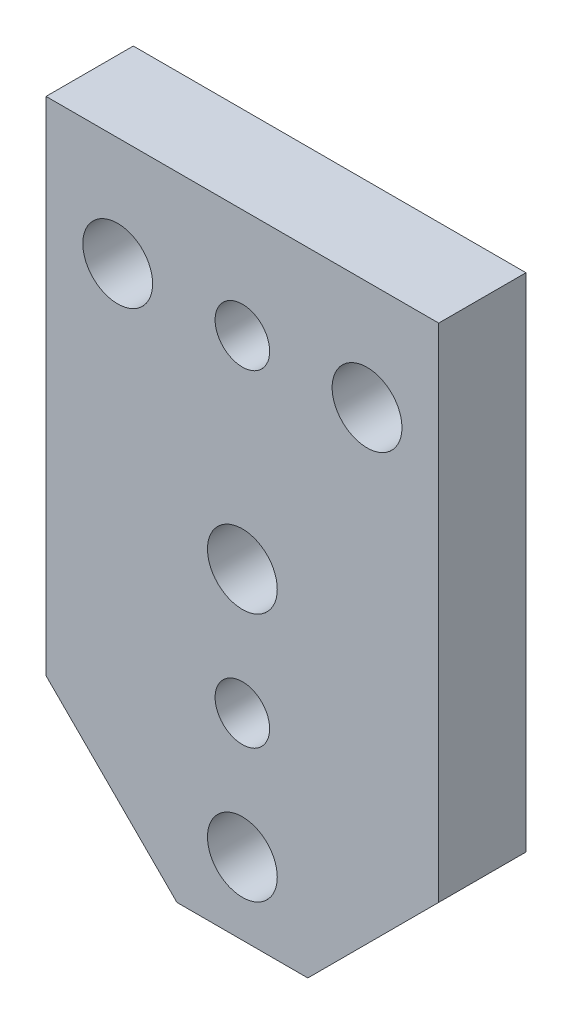
ISO-10303-21;
HEADER;
FILE_DESCRIPTION(('STEP AP214'),'2;1');
FILE_NAME('part.step','',(''),(''),'','','');
FILE_SCHEMA(('AUTOMOTIVE_DESIGN { 1 0 10303 214 1 1 1 1 }'));
ENDSEC;
DATA;
#1=APPLICATION_CONTEXT('core data for automotive mechanical design processes');
#2=APPLICATION_PROTOCOL_DEFINITION('international standard','automotive_design',2000,#1);
#3=PRODUCT_CONTEXT('',#1,'mechanical');
#4=PRODUCT('Part','Part','',(#3));
#5=PRODUCT_RELATED_PRODUCT_CATEGORY('part','',(#4));
#6=PRODUCT_DEFINITION_FORMATION('','',#4);
#7=PRODUCT_DEFINITION_CONTEXT('part definition',#1,'design');
#8=PRODUCT_DEFINITION('design','',#6,#7);
#9=PRODUCT_DEFINITION_SHAPE('','',#8);
#10=(LENGTH_UNIT() NAMED_UNIT(*) SI_UNIT(.MILLI.,.METRE.));
#11=(NAMED_UNIT(*) PLANE_ANGLE_UNIT() SI_UNIT($,.RADIAN.));
#12=(NAMED_UNIT(*) SI_UNIT($,.STERADIAN.) SOLID_ANGLE_UNIT());
#13=UNCERTAINTY_MEASURE_WITH_UNIT(LENGTH_MEASURE(1.E-05),#10,'distance_accuracy_value','');
#14=(GEOMETRIC_REPRESENTATION_CONTEXT(3) GLOBAL_UNCERTAINTY_ASSIGNED_CONTEXT((#13)) GLOBAL_UNIT_ASSIGNED_CONTEXT((#10,
#11,#12)) REPRESENTATION_CONTEXT('',''));
#15=CARTESIAN_POINT('',(0.,0.,0.));
#16=DIRECTION('',(0.,0.,1.));
#17=DIRECTION('',(1.,0.,0.));
#18=AXIS2_PLACEMENT_3D('',#15,#16,#17);
#19=CARTESIAN_POINT('',(9.,-5.,2.));
#20=DIRECTION('',(-1.,0.,0.));
#21=DIRECTION('',(0.,0.,1.));
#22=AXIS2_PLACEMENT_3D('',#19,#20,#21);
#23=PLANE('',#22);
#24=DIRECTION('',(0.,1.,0.));
#25=VECTOR('',#24,1.);
#26=CARTESIAN_POINT('',(9.,-5.,2.));
#27=LINE('',#26,#25);
#28=CARTESIAN_POINT('',(9.,-18.,2.));
#29=VERTEX_POINT('',#28);
#30=CARTESIAN_POINT('',(9.,5.,2.));
#31=VERTEX_POINT('',#30);
#32=EDGE_CURVE('E88',#29,#31,#27,.T.);
#33=ORIENTED_EDGE('',*,*,#32,.F.);
#34=DIRECTION('',(0.,0.,-1.));
#35=VECTOR('',#34,1.);
#36=CARTESIAN_POINT('',(9.,-18.,2.));
#37=LINE('',#36,#35);
#38=CARTESIAN_POINT('',(9.,-18.,-2.));
#39=VERTEX_POINT('',#38);
#40=EDGE_CURVE('E11',#29,#39,#37,.T.);
#41=ORIENTED_EDGE('',*,*,#40,.T.);
#42=DIRECTION('',(0.,1.,0.));
#43=VECTOR('',#42,1.);
#44=CARTESIAN_POINT('',(9.,-5.,-2.));
#45=LINE('',#44,#43);
#46=CARTESIAN_POINT('',(9.,5.,-2.));
#47=VERTEX_POINT('',#46);
#48=EDGE_CURVE('E107',#39,#47,#45,.T.);
#49=ORIENTED_EDGE('',*,*,#48,.T.);
#50=DIRECTION('',(0.,0.,-1.));
#51=VECTOR('',#50,1.);
#52=CARTESIAN_POINT('',(9.,5.,2.));
#53=LINE('',#52,#51);
#54=EDGE_CURVE('E101',#31,#47,#53,.T.);
#55=ORIENTED_EDGE('',*,*,#54,.F.);
#56=EDGE_LOOP('',(#33,#41,#49,#55));
#57=FACE_BOUND('',#56,.T.);
#58=ADVANCED_FACE('F35',(#57),#23,.F.);
#59=CARTESIAN_POINT('',(-9.,5.,2.));
#60=DIRECTION('',(0.,-1.,0.));
#61=DIRECTION('',(0.,0.,-1.));
#62=AXIS2_PLACEMENT_3D('',#59,#60,#61);
#63=PLANE('',#62);
#64=DIRECTION('',(-1.,0.,0.));
#65=VECTOR('',#64,1.);
#66=CARTESIAN_POINT('',(-9.,5.,-2.));
#67=LINE('',#66,#65);
#68=CARTESIAN_POINT('',(-9.,5.,-2.));
#69=VERTEX_POINT('',#68);
#70=EDGE_CURVE('E140',#47,#69,#67,.T.);
#71=ORIENTED_EDGE('',*,*,#70,.T.);
#72=DIRECTION('',(0.,0.,-1.));
#73=VECTOR('',#72,1.);
#74=CARTESIAN_POINT('',(-9.,5.,2.));
#75=LINE('',#74,#73);
#76=CARTESIAN_POINT('',(-9.,5.,2.));
#77=VERTEX_POINT('',#76);
#78=EDGE_CURVE('E103',#77,#69,#75,.T.);
#79=ORIENTED_EDGE('',*,*,#78,.F.);
#80=DIRECTION('',(-1.,0.,0.));
#81=VECTOR('',#80,1.);
#82=CARTESIAN_POINT('',(-9.,5.,2.));
#83=LINE('',#82,#81);
#84=EDGE_CURVE('E91',#31,#77,#83,.T.);
#85=ORIENTED_EDGE('',*,*,#84,.F.);
#86=ORIENTED_EDGE('',*,*,#54,.T.);
#87=EDGE_LOOP('',(#71,#79,#85,#86));
#88=FACE_BOUND('',#87,.T.);
#89=ADVANCED_FACE('F100',(#88),#63,.F.);
#90=CARTESIAN_POINT('',(-9.,-5.,2.));
#91=DIRECTION('',(1.,0.,0.));
#92=DIRECTION('',(0.,0.,-1.));
#93=AXIS2_PLACEMENT_3D('',#90,#91,#92);
#94=PLANE('',#93);
#95=DIRECTION('',(0.,-1.,0.));
#96=VECTOR('',#95,1.);
#97=CARTESIAN_POINT('',(-9.,-5.,-2.));
#98=LINE('',#97,#96);
#99=CARTESIAN_POINT('',(-9.,-18.,-2.));
#100=VERTEX_POINT('',#99);
#101=EDGE_CURVE('E96',#69,#100,#98,.T.);
#102=ORIENTED_EDGE('',*,*,#101,.T.);
#103=DIRECTION('',(0.,0.,1.));
#104=VECTOR('',#103,1.);
#105=CARTESIAN_POINT('',(-9.,-18.,2.));
#106=LINE('',#105,#104);
#107=CARTESIAN_POINT('',(-9.,-18.,2.));
#108=VERTEX_POINT('',#107);
#109=EDGE_CURVE('E58',#100,#108,#106,.T.);
#110=ORIENTED_EDGE('',*,*,#109,.T.);
#111=DIRECTION('',(0.,-1.,0.));
#112=VECTOR('',#111,1.);
#113=CARTESIAN_POINT('',(-9.,-5.,2.));
#114=LINE('',#113,#112);
#115=EDGE_CURVE('E104',#77,#108,#114,.T.);
#116=ORIENTED_EDGE('',*,*,#115,.F.);
#117=ORIENTED_EDGE('',*,*,#78,.T.);
#118=EDGE_LOOP('',(#102,#110,#116,#117));
#119=FACE_BOUND('',#118,.T.);
#120=ADVANCED_FACE('F139',(#119),#94,.F.);
#121=CARTESIAN_POINT('',(0.,0.,2.));
#122=DIRECTION('',(0.,0.,-1.));
#123=DIRECTION('',(-1.,0.,0.));
#124=AXIS2_PLACEMENT_3D('',#121,#122,#123);
#125=PLANE('',#124);
#126=CARTESIAN_POINT('',(0.,-14.983,2.));
#127=DIRECTION('',(0.,0.,1.));
#128=DIRECTION('',(1.,0.,0.));
#129=AXIS2_PLACEMENT_3D('',#126,#127,#128);
#130=CIRCLE('',#129,1.25);
#131=CARTESIAN_POINT('',(1.25,-14.983,2.));
#132=VERTEX_POINT('',#131);
#133=EDGE_CURVE('E179',#132,#132,#130,.T.);
#134=ORIENTED_EDGE('',*,*,#133,.F.);
#135=EDGE_LOOP('',(#134));
#136=FACE_BOUND('',#135,.T.);
#137=CARTESIAN_POINT('',(0.,0.00280000000000149,2.));
#138=DIRECTION('',(0.,0.,1.));
#139=DIRECTION('',(1.,0.,0.));
#140=AXIS2_PLACEMENT_3D('',#137,#138,#139);
#141=CIRCLE('',#140,1.25);
#142=CARTESIAN_POINT('',(1.24999999999999,0.00280000000000149,2.));
#143=VERTEX_POINT('',#142);
#144=EDGE_CURVE('E173',#143,#143,#141,.T.);
#145=ORIENTED_EDGE('',*,*,#144,.F.);
#146=EDGE_LOOP('',(#145));
#147=FACE_BOUND('',#146,.T.);
#148=CARTESIAN_POINT('',(0.,-9.26800000000001,2.));
#149=DIRECTION('',(0.,0.,1.));
#150=DIRECTION('',(1.,0.,0.));
#151=AXIS2_PLACEMENT_3D('',#148,#149,#150);
#152=CIRCLE('',#151,1.6);
#153=CARTESIAN_POINT('',(1.6,-9.26800000000001,2.));
#154=VERTEX_POINT('',#153);
#155=EDGE_CURVE('E167',#154,#154,#152,.T.);
#156=ORIENTED_EDGE('',*,*,#155,.F.);
#157=EDGE_LOOP('',(#156));
#158=FACE_BOUND('',#157,.T.);
#159=CARTESIAN_POINT('',(0.,-20.698,2.));
#160=DIRECTION('',(0.,0.,1.));
#161=DIRECTION('',(1.,0.,0.));
#162=AXIS2_PLACEMENT_3D('',#159,#160,#161);
#163=CIRCLE('',#162,1.6);
#164=CARTESIAN_POINT('',(1.6,-20.698,2.));
#165=VERTEX_POINT('',#164);
#166=EDGE_CURVE('E161',#165,#165,#163,.T.);
#167=ORIENTED_EDGE('',*,*,#166,.F.);
#168=EDGE_LOOP('',(#167));
#169=FACE_BOUND('',#168,.T.);
#170=CARTESIAN_POINT('',(5.715,0.00280000000000149,2.));
#171=DIRECTION('',(0.,0.,1.));
#172=DIRECTION('',(1.,0.,0.));
#173=AXIS2_PLACEMENT_3D('',#170,#171,#172);
#174=CIRCLE('',#173,1.6);
#175=CARTESIAN_POINT('',(7.315,0.00280000000000149,2.));
#176=VERTEX_POINT('',#175);
#177=EDGE_CURVE('E155',#176,#176,#174,.T.);
#178=ORIENTED_EDGE('',*,*,#177,.F.);
#179=EDGE_LOOP('',(#178));
#180=FACE_BOUND('',#179,.T.);
#181=CARTESIAN_POINT('',(-5.715,0.00280000000000149,2.));
#182=DIRECTION('',(0.,0.,1.));
#183=DIRECTION('',(1.,0.,0.));
#184=AXIS2_PLACEMENT_3D('',#181,#182,#183);
#185=CIRCLE('',#184,1.6);
#186=CARTESIAN_POINT('',(-4.115,0.00280000000000149,2.));
#187=VERTEX_POINT('',#186);
#188=EDGE_CURVE('E149',#187,#187,#185,.T.);
#189=ORIENTED_EDGE('',*,*,#188,.F.);
#190=EDGE_LOOP('',(#189));
#191=FACE_BOUND('',#190,.T.);
#192=ORIENTED_EDGE('',*,*,#115,.T.);
#193=DIRECTION('',(-0.707106781186546,0.707106781186549,0.));
#194=VECTOR('',#193,1.);
#195=CARTESIAN_POINT('',(-3.00000000000001,-24.,2.));
#196=LINE('',#195,#194);
#197=CARTESIAN_POINT('',(-3.00000000000001,-24.,2.));
#198=VERTEX_POINT('',#197);
#199=EDGE_CURVE('E43',#108,#198,#196,.F.);
#200=ORIENTED_EDGE('',*,*,#199,.T.);
#201=DIRECTION('',(1.,0.,0.));
#202=VECTOR('',#201,1.);
#203=CARTESIAN_POINT('',(9.,-24.,2.));
#204=LINE('',#203,#202);
#205=CARTESIAN_POINT('',(2.99999999999998,-24.,2.));
#206=VERTEX_POINT('',#205);
#207=EDGE_CURVE('E125',#198,#206,#204,.T.);
#208=ORIENTED_EDGE('',*,*,#207,.T.);
#209=DIRECTION('',(-0.707106781186549,-0.707106781186546,0.));
#210=VECTOR('',#209,1.);
#211=CARTESIAN_POINT('',(9.,-18.,2.));
#212=LINE('',#211,#210);
#213=EDGE_CURVE('E50',#206,#29,#212,.F.);
#214=ORIENTED_EDGE('',*,*,#213,.T.);
#215=ORIENTED_EDGE('',*,*,#32,.T.);
#216=ORIENTED_EDGE('',*,*,#84,.T.);
#217=EDGE_LOOP('',(#192,#200,#208,#214,#215,#216));
#218=FACE_BOUND('',#217,.T.);
#219=ADVANCED_FACE('F90',(#136,#147,#158,#169,#180,#191,#218),#125,.F.);
#220=CARTESIAN_POINT('',(0.,0.,-2.));
#221=DIRECTION('',(0.,0.,-1.));
#222=DIRECTION('',(-1.,0.,0.));
#223=AXIS2_PLACEMENT_3D('',#220,#221,#222);
#224=PLANE('',#223);
#225=CARTESIAN_POINT('',(0.,-14.983,-2.));
#226=DIRECTION('',(0.,0.,1.));
#227=DIRECTION('',(1.,0.,0.));
#228=AXIS2_PLACEMENT_3D('',#225,#226,#227);
#229=CIRCLE('',#228,1.25);
#230=CARTESIAN_POINT('',(1.25,-14.983,-2.));
#231=VERTEX_POINT('',#230);
#232=EDGE_CURVE('E176',#231,#231,#229,.T.);
#233=ORIENTED_EDGE('',*,*,#232,.T.);
#234=EDGE_LOOP('',(#233));
#235=FACE_BOUND('',#234,.T.);
#236=CARTESIAN_POINT('',(0.,0.00280000000000149,-2.));
#237=DIRECTION('',(0.,0.,1.));
#238=DIRECTION('',(1.,0.,0.));
#239=AXIS2_PLACEMENT_3D('',#236,#237,#238);
#240=CIRCLE('',#239,1.25);
#241=CARTESIAN_POINT('',(1.24999999999999,0.00280000000000149,-2.));
#242=VERTEX_POINT('',#241);
#243=EDGE_CURVE('E170',#242,#242,#240,.T.);
#244=ORIENTED_EDGE('',*,*,#243,.T.);
#245=EDGE_LOOP('',(#244));
#246=FACE_BOUND('',#245,.T.);
#247=CARTESIAN_POINT('',(0.,-9.26800000000001,-2.));
#248=DIRECTION('',(0.,0.,1.));
#249=DIRECTION('',(1.,0.,0.));
#250=AXIS2_PLACEMENT_3D('',#247,#248,#249);
#251=CIRCLE('',#250,1.6);
#252=CARTESIAN_POINT('',(1.6,-9.26800000000001,-2.));
#253=VERTEX_POINT('',#252);
#254=EDGE_CURVE('E164',#253,#253,#251,.T.);
#255=ORIENTED_EDGE('',*,*,#254,.T.);
#256=EDGE_LOOP('',(#255));
#257=FACE_BOUND('',#256,.T.);
#258=CARTESIAN_POINT('',(0.,-20.698,-2.));
#259=DIRECTION('',(0.,0.,1.));
#260=DIRECTION('',(1.,0.,0.));
#261=AXIS2_PLACEMENT_3D('',#258,#259,#260);
#262=CIRCLE('',#261,1.6);
#263=CARTESIAN_POINT('',(1.6,-20.698,-2.));
#264=VERTEX_POINT('',#263);
#265=EDGE_CURVE('E158',#264,#264,#262,.T.);
#266=ORIENTED_EDGE('',*,*,#265,.T.);
#267=EDGE_LOOP('',(#266));
#268=FACE_BOUND('',#267,.T.);
#269=CARTESIAN_POINT('',(5.715,0.00280000000000149,-2.));
#270=DIRECTION('',(0.,0.,1.));
#271=DIRECTION('',(1.,0.,0.));
#272=AXIS2_PLACEMENT_3D('',#269,#270,#271);
#273=CIRCLE('',#272,1.6);
#274=CARTESIAN_POINT('',(7.315,0.00280000000000149,-2.));
#275=VERTEX_POINT('',#274);
#276=EDGE_CURVE('E152',#275,#275,#273,.T.);
#277=ORIENTED_EDGE('',*,*,#276,.T.);
#278=EDGE_LOOP('',(#277));
#279=FACE_BOUND('',#278,.T.);
#280=CARTESIAN_POINT('',(-5.715,0.00280000000000149,-2.));
#281=DIRECTION('',(0.,0.,1.));
#282=DIRECTION('',(1.,0.,0.));
#283=AXIS2_PLACEMENT_3D('',#280,#281,#282);
#284=CIRCLE('',#283,1.6);
#285=CARTESIAN_POINT('',(-4.115,0.00280000000000149,-2.));
#286=VERTEX_POINT('',#285);
#287=EDGE_CURVE('E145',#286,#286,#284,.T.);
#288=ORIENTED_EDGE('',*,*,#287,.T.);
#289=EDGE_LOOP('',(#288));
#290=FACE_BOUND('',#289,.T.);
#291=DIRECTION('',(1.,0.,0.));
#292=VECTOR('',#291,1.);
#293=CARTESIAN_POINT('',(9.,-24.,-2.));
#294=LINE('',#293,#292);
#295=CARTESIAN_POINT('',(-3.00000000000001,-24.,-2.));
#296=VERTEX_POINT('',#295);
#297=CARTESIAN_POINT('',(2.99999999999998,-24.,-2.));
#298=VERTEX_POINT('',#297);
#299=EDGE_CURVE('E133',#296,#298,#294,.T.);
#300=ORIENTED_EDGE('',*,*,#299,.F.);
#301=DIRECTION('',(0.707106781186546,-0.707106781186549,0.));
#302=VECTOR('',#301,1.);
#303=CARTESIAN_POINT('',(-13.5,-13.5,-2.));
#304=LINE('',#303,#302);
#305=EDGE_CURVE('E120',#296,#100,#304,.F.);
#306=ORIENTED_EDGE('',*,*,#305,.T.);
#307=ORIENTED_EDGE('',*,*,#101,.F.);
#308=ORIENTED_EDGE('',*,*,#70,.F.);
#309=ORIENTED_EDGE('',*,*,#48,.F.);
#310=DIRECTION('',(0.707106781186549,0.707106781186546,0.));
#311=VECTOR('',#310,1.);
#312=CARTESIAN_POINT('',(13.5,-13.5,-2.));
#313=LINE('',#312,#311);
#314=EDGE_CURVE('E118',#39,#298,#313,.F.);
#315=ORIENTED_EDGE('',*,*,#314,.T.);
#316=EDGE_LOOP('',(#300,#306,#307,#308,#309,#315));
#317=FACE_BOUND('',#316,.T.);
#318=ADVANCED_FACE('F138',(#235,#246,#257,#268,#279,#290,#317),#224,.T.);
#319=CARTESIAN_POINT('',(9.,-24.,2.));
#320=DIRECTION('',(0.,1.,0.));
#321=DIRECTION('',(0.,0.,1.));
#322=AXIS2_PLACEMENT_3D('',#319,#320,#321);
#323=PLANE('',#322);
#324=ORIENTED_EDGE('',*,*,#207,.F.);
#325=DIRECTION('',(0.,0.,-1.));
#326=VECTOR('',#325,1.);
#327=CARTESIAN_POINT('',(-3.00000000000001,-24.,2.));
#328=LINE('',#327,#326);
#329=EDGE_CURVE('E111',#198,#296,#328,.T.);
#330=ORIENTED_EDGE('',*,*,#329,.T.);
#331=ORIENTED_EDGE('',*,*,#299,.T.);
#332=DIRECTION('',(0.,0.,1.));
#333=VECTOR('',#332,1.);
#334=CARTESIAN_POINT('',(2.99999999999998,-24.,2.));
#335=LINE('',#334,#333);
#336=EDGE_CURVE('E109',#298,#206,#335,.T.);
#337=ORIENTED_EDGE('',*,*,#336,.T.);
#338=EDGE_LOOP('',(#324,#330,#331,#337));
#339=FACE_BOUND('',#338,.T.);
#340=ADVANCED_FACE('F129',(#339),#323,.F.);
#341=CARTESIAN_POINT('',(-5.715,0.00280000000000149,2.));
#342=DIRECTION('',(0.,0.,1.));
#343=DIRECTION('',(1.,0.,0.));
#344=AXIS2_PLACEMENT_3D('',#341,#342,#343);
#345=CYLINDRICAL_SURFACE('',#344,1.6);
#346=ORIENTED_EDGE('',*,*,#287,.F.);
#347=EDGE_LOOP('',(#346));
#348=FACE_BOUND('',#347,.T.);
#349=ORIENTED_EDGE('',*,*,#188,.T.);
#350=EDGE_LOOP('',(#349));
#351=FACE_BOUND('',#350,.T.);
#352=ADVANCED_FACE('F198',(#348,#351),#345,.F.);
#353=CARTESIAN_POINT('',(5.715,0.00280000000000149,2.));
#354=DIRECTION('',(0.,0.,1.));
#355=DIRECTION('',(1.,0.,0.));
#356=AXIS2_PLACEMENT_3D('',#353,#354,#355);
#357=CYLINDRICAL_SURFACE('',#356,1.6);
#358=ORIENTED_EDGE('',*,*,#276,.F.);
#359=EDGE_LOOP('',(#358));
#360=FACE_BOUND('',#359,.T.);
#361=ORIENTED_EDGE('',*,*,#177,.T.);
#362=EDGE_LOOP('',(#361));
#363=FACE_BOUND('',#362,.T.);
#364=ADVANCED_FACE('F200',(#360,#363),#357,.F.);
#365=CARTESIAN_POINT('',(0.,-20.698,2.));
#366=DIRECTION('',(0.,0.,1.));
#367=DIRECTION('',(1.,0.,0.));
#368=AXIS2_PLACEMENT_3D('',#365,#366,#367);
#369=CYLINDRICAL_SURFACE('',#368,1.6);
#370=ORIENTED_EDGE('',*,*,#265,.F.);
#371=EDGE_LOOP('',(#370));
#372=FACE_BOUND('',#371,.T.);
#373=ORIENTED_EDGE('',*,*,#166,.T.);
#374=EDGE_LOOP('',(#373));
#375=FACE_BOUND('',#374,.T.);
#376=ADVANCED_FACE('F207',(#372,#375),#369,.F.);
#377=CARTESIAN_POINT('',(0.,-9.26800000000001,2.));
#378=DIRECTION('',(0.,0.,1.));
#379=DIRECTION('',(1.,0.,0.));
#380=AXIS2_PLACEMENT_3D('',#377,#378,#379);
#381=CYLINDRICAL_SURFACE('',#380,1.6);
#382=ORIENTED_EDGE('',*,*,#254,.F.);
#383=EDGE_LOOP('',(#382));
#384=FACE_BOUND('',#383,.T.);
#385=ORIENTED_EDGE('',*,*,#155,.T.);
#386=EDGE_LOOP('',(#385));
#387=FACE_BOUND('',#386,.T.);
#388=ADVANCED_FACE('F220',(#384,#387),#381,.F.);
#389=CARTESIAN_POINT('',(-3.00000000000001,-24.,2.));
#390=DIRECTION('',(0.707106781186549,0.707106781186546,0.));
#391=DIRECTION('',(0.,0.,-1.));
#392=AXIS2_PLACEMENT_3D('',#389,#390,#391);
#393=PLANE('',#392);
#394=ORIENTED_EDGE('',*,*,#199,.F.);
#395=ORIENTED_EDGE('',*,*,#109,.F.);
#396=ORIENTED_EDGE('',*,*,#305,.F.);
#397=ORIENTED_EDGE('',*,*,#329,.F.);
#398=EDGE_LOOP('',(#394,#395,#396,#397));
#399=FACE_BOUND('',#398,.T.);
#400=ADVANCED_FACE('F135',(#399),#393,.F.);
#401=CARTESIAN_POINT('',(9.,-18.,2.));
#402=DIRECTION('',(-0.707106781186546,0.707106781186549,0.));
#403=DIRECTION('',(0.,0.,-1.));
#404=AXIS2_PLACEMENT_3D('',#401,#402,#403);
#405=PLANE('',#404);
#406=ORIENTED_EDGE('',*,*,#213,.F.);
#407=ORIENTED_EDGE('',*,*,#336,.F.);
#408=ORIENTED_EDGE('',*,*,#314,.F.);
#409=ORIENTED_EDGE('',*,*,#40,.F.);
#410=EDGE_LOOP('',(#406,#407,#408,#409));
#411=FACE_BOUND('',#410,.T.);
#412=ADVANCED_FACE('F37',(#411),#405,.F.);
#413=CARTESIAN_POINT('',(0.,0.00280000000000149,2.));
#414=DIRECTION('',(0.,0.,1.));
#415=DIRECTION('',(1.,0.,0.));
#416=AXIS2_PLACEMENT_3D('',#413,#414,#415);
#417=CYLINDRICAL_SURFACE('',#416,1.25);
#418=ORIENTED_EDGE('',*,*,#243,.F.);
#419=EDGE_LOOP('',(#418));
#420=FACE_BOUND('',#419,.T.);
#421=ORIENTED_EDGE('',*,*,#144,.T.);
#422=EDGE_LOOP('',(#421));
#423=FACE_BOUND('',#422,.T.);
#424=ADVANCED_FACE('F225',(#420,#423),#417,.F.);
#425=CARTESIAN_POINT('',(0.,-14.983,2.));
#426=DIRECTION('',(0.,0.,1.));
#427=DIRECTION('',(1.,0.,0.));
#428=AXIS2_PLACEMENT_3D('',#425,#426,#427);
#429=CYLINDRICAL_SURFACE('',#428,1.25);
#430=ORIENTED_EDGE('',*,*,#232,.F.);
#431=EDGE_LOOP('',(#430));
#432=FACE_BOUND('',#431,.T.);
#433=ORIENTED_EDGE('',*,*,#133,.T.);
#434=EDGE_LOOP('',(#433));
#435=FACE_BOUND('',#434,.T.);
#436=ADVANCED_FACE('F183',(#432,#435),#429,.F.);
#437=CLOSED_SHELL('',(#58,#89,#120,#219,#318,#340,#352,#364,#376,#388,#400,#412,#424,#436));
#438=MANIFOLD_SOLID_BREP('B2',#437);
#439=ADVANCED_BREP_SHAPE_REPRESENTATION('',(#18,#438),#14);
#440=SHAPE_DEFINITION_REPRESENTATION(#9,#439);
ENDSEC;
END-ISO-10303-21;
